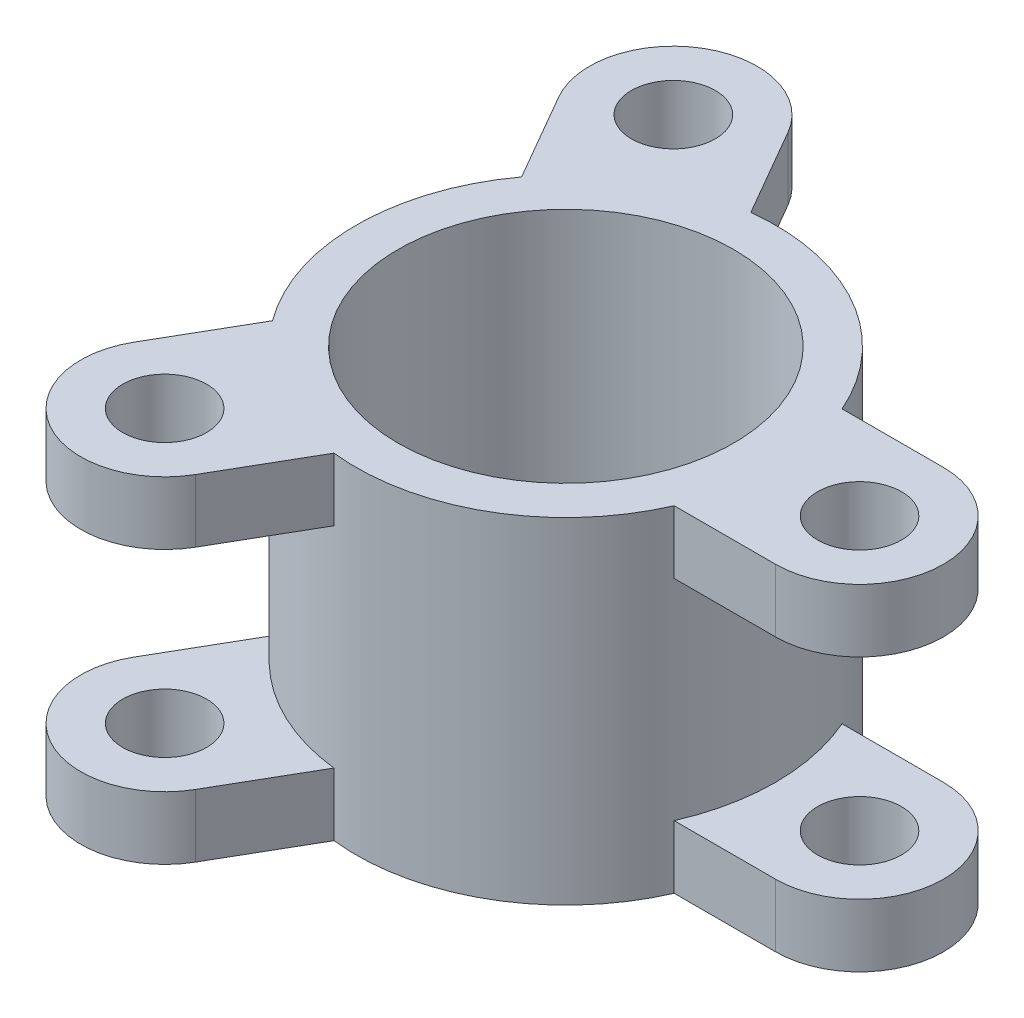
ISO-10303-21;
HEADER;
FILE_DESCRIPTION(('STEP AP214'),'2;1');
FILE_NAME('part.step','',(''),(''),'','','');
FILE_SCHEMA(('AUTOMOTIVE_DESIGN { 1 0 10303 214 1 1 1 1 }'));
ENDSEC;
DATA;
#1=APPLICATION_CONTEXT('core data for automotive mechanical design processes');
#2=APPLICATION_PROTOCOL_DEFINITION('international standard','automotive_design',2000,#1);
#3=PRODUCT_CONTEXT('',#1,'mechanical');
#4=PRODUCT('Part','Part','',(#3));
#5=PRODUCT_RELATED_PRODUCT_CATEGORY('part','',(#4));
#6=PRODUCT_DEFINITION_FORMATION('','',#4);
#7=PRODUCT_DEFINITION_CONTEXT('part definition',#1,'design');
#8=PRODUCT_DEFINITION('design','',#6,#7);
#9=PRODUCT_DEFINITION_SHAPE('','',#8);
#10=(LENGTH_UNIT() NAMED_UNIT(*) SI_UNIT(.MILLI.,.METRE.));
#11=(NAMED_UNIT(*) PLANE_ANGLE_UNIT() SI_UNIT($,.RADIAN.));
#12=(NAMED_UNIT(*) SI_UNIT($,.STERADIAN.) SOLID_ANGLE_UNIT());
#13=UNCERTAINTY_MEASURE_WITH_UNIT(LENGTH_MEASURE(1.E-05),#10,'distance_accuracy_value','');
#14=(GEOMETRIC_REPRESENTATION_CONTEXT(3) GLOBAL_UNCERTAINTY_ASSIGNED_CONTEXT((#13)) GLOBAL_UNIT_ASSIGNED_CONTEXT((#10,
#11,#12)) REPRESENTATION_CONTEXT('',''));
#15=CARTESIAN_POINT('',(0.,0.,0.));
#16=DIRECTION('',(0.,0.,1.));
#17=DIRECTION('',(1.,0.,0.));
#18=AXIS2_PLACEMENT_3D('',#15,#16,#17);
#19=CARTESIAN_POINT('',(0.,80.,0.));
#20=DIRECTION('',(0.,-1.,0.));
#21=DIRECTION('',(0.,0.,-1.));
#22=AXIS2_PLACEMENT_3D('',#19,#20,#21);
#23=CYLINDRICAL_SURFACE('',#22,50.);
#24=DIRECTION('',(0.,-1.,0.));
#25=VECTOR('',#24,1.);
#26=CARTESIAN_POINT('',(45.8257569495584,15.,-20.));
#27=LINE('',#26,#25);
#28=CARTESIAN_POINT('',(45.8257569495584,15.,-20.));
#29=VERTEX_POINT('',#28);
#30=CARTESIAN_POINT('',(45.8257569495584,0.,-20.));
#31=VERTEX_POINT('',#30);
#32=EDGE_CURVE('E327',#29,#31,#27,.T.);
#33=ORIENTED_EDGE('',*,*,#32,.T.);
#34=CARTESIAN_POINT('',(0.,0.,0.));
#35=DIRECTION('',(0.,1.,0.));
#36=DIRECTION('',(0.,0.,1.));
#37=AXIS2_PLACEMENT_3D('',#34,#35,#36);
#38=CIRCLE('',#37,50.);
#39=CARTESIAN_POINT('',(-5.59237039908998,0.,-49.6862696659689));
#40=VERTEX_POINT('',#39);
#41=EDGE_CURVE('E411',#31,#40,#38,.T.);
#42=ORIENTED_EDGE('',*,*,#41,.T.);
#43=DIRECTION('',(0.,-1.,0.));
#44=VECTOR('',#43,1.);
#45=CARTESIAN_POINT('',(-5.59237039908997,15.,-49.6862696659689));
#46=LINE('',#45,#44);
#47=CARTESIAN_POINT('',(-5.59237039908997,15.,-49.6862696659689));
#48=VERTEX_POINT('',#47);
#49=EDGE_CURVE('E360',#48,#40,#46,.T.);
#50=ORIENTED_EDGE('',*,*,#49,.F.);
#51=CARTESIAN_POINT('',(0.,15.,0.));
#52=DIRECTION('',(0.,1.,0.));
#53=DIRECTION('',(0.,0.,1.));
#54=AXIS2_PLACEMENT_3D('',#51,#52,#53);
#55=CIRCLE('',#54,50.);
#56=CARTESIAN_POINT('',(-40.2333865504677,15.,-29.6862696659692));
#57=VERTEX_POINT('',#56);
#58=EDGE_CURVE('E343',#48,#57,#55,.T.);
#59=ORIENTED_EDGE('',*,*,#58,.T.);
#60=DIRECTION('',(0.,-1.,0.));
#61=VECTOR('',#60,1.);
#62=CARTESIAN_POINT('',(-40.2333865504677,15.,-29.6862696659692));
#63=LINE('',#62,#61);
#64=CARTESIAN_POINT('',(-40.2333865504677,0.,-29.6862696659692));
#65=VERTEX_POINT('',#64);
#66=EDGE_CURVE('E363',#57,#65,#63,.T.);
#67=ORIENTED_EDGE('',*,*,#66,.T.);
#68=CARTESIAN_POINT('',(-40.2333865504681,0.,29.6862696659687));
#69=VERTEX_POINT('',#68);
#70=EDGE_CURVE('E408',#65,#69,#38,.T.);
#71=ORIENTED_EDGE('',*,*,#70,.T.);
#72=DIRECTION('',(0.,-1.,0.));
#73=VECTOR('',#72,1.);
#74=CARTESIAN_POINT('',(-40.2333865504681,15.,29.6862696659687));
#75=LINE('',#74,#73);
#76=CARTESIAN_POINT('',(-40.2333865504681,15.,29.6862696659687));
#77=VERTEX_POINT('',#76);
#78=EDGE_CURVE('E396',#77,#69,#75,.T.);
#79=ORIENTED_EDGE('',*,*,#78,.F.);
#80=CARTESIAN_POINT('',(0.,15.,0.));
#81=DIRECTION('',(0.,1.,0.));
#82=DIRECTION('',(0.,0.,1.));
#83=AXIS2_PLACEMENT_3D('',#80,#81,#82);
#84=CIRCLE('',#83,50.);
#85=CARTESIAN_POINT('',(-5.59237039909065,15.,49.6862696659688));
#86=VERTEX_POINT('',#85);
#87=EDGE_CURVE('E379',#77,#86,#84,.T.);
#88=ORIENTED_EDGE('',*,*,#87,.T.);
#89=DIRECTION('',(0.,-1.,0.));
#90=VECTOR('',#89,1.);
#91=CARTESIAN_POINT('',(-5.59237039909065,15.,49.6862696659688));
#92=LINE('',#91,#90);
#93=CARTESIAN_POINT('',(-5.59237039909065,0.,49.6862696659688));
#94=VERTEX_POINT('',#93);
#95=EDGE_CURVE('E399',#86,#94,#92,.T.);
#96=ORIENTED_EDGE('',*,*,#95,.T.);
#97=CARTESIAN_POINT('',(45.8257569495584,0.,20.));
#98=VERTEX_POINT('',#97);
#99=EDGE_CURVE('E38',#94,#98,#38,.T.);
#100=ORIENTED_EDGE('',*,*,#99,.T.);
#101=DIRECTION('',(0.,-1.,0.));
#102=VECTOR('',#101,1.);
#103=CARTESIAN_POINT('',(45.8257569495584,15.,20.));
#104=LINE('',#103,#102);
#105=CARTESIAN_POINT('',(45.8257569495584,15.,20.));
#106=VERTEX_POINT('',#105);
#107=EDGE_CURVE('E324',#106,#98,#104,.T.);
#108=ORIENTED_EDGE('',*,*,#107,.F.);
#109=CARTESIAN_POINT('',(0.,15.,0.));
#110=DIRECTION('',(0.,1.,0.));
#111=DIRECTION('',(0.,0.,1.));
#112=AXIS2_PLACEMENT_3D('',#109,#110,#111);
#113=CIRCLE('',#112,50.);
#114=EDGE_CURVE('E304',#106,#29,#113,.T.);
#115=ORIENTED_EDGE('',*,*,#114,.T.);
#116=EDGE_LOOP('',(#33,#42,#50,#59,#67,#71,#79,#88,#96,#100,#108,#115));
#117=FACE_BOUND('',#116,.T.);
#118=DIRECTION('',(0.,1.,0.));
#119=VECTOR('',#118,1.);
#120=CARTESIAN_POINT('',(45.8257569495584,65.,20.));
#121=LINE('',#120,#119);
#122=CARTESIAN_POINT('',(45.8257569495584,65.,20.));
#123=VERTEX_POINT('',#122);
#124=CARTESIAN_POINT('',(45.8257569495584,80.,20.));
#125=VERTEX_POINT('',#124);
#126=EDGE_CURVE('E206',#123,#125,#121,.T.);
#127=ORIENTED_EDGE('',*,*,#126,.T.);
#128=CARTESIAN_POINT('',(0.,80.,0.));
#129=DIRECTION('',(0.,1.,0.));
#130=DIRECTION('',(0.,0.,1.));
#131=AXIS2_PLACEMENT_3D('',#128,#129,#130);
#132=CIRCLE('',#131,50.);
#133=CARTESIAN_POINT('',(-5.59237039909065,80.,49.6862696659688));
#134=VERTEX_POINT('',#133);
#135=EDGE_CURVE('E11',#134,#125,#132,.T.);
#136=ORIENTED_EDGE('',*,*,#135,.F.);
#137=DIRECTION('',(0.,1.,0.));
#138=VECTOR('',#137,1.);
#139=CARTESIAN_POINT('',(-5.59237039909065,65.,49.6862696659688));
#140=LINE('',#139,#138);
#141=CARTESIAN_POINT('',(-5.59237039909065,65.,49.6862696659688));
#142=VERTEX_POINT('',#141);
#143=EDGE_CURVE('E287',#142,#134,#140,.T.);
#144=ORIENTED_EDGE('',*,*,#143,.F.);
#145=CARTESIAN_POINT('',(0.,65.,0.));
#146=DIRECTION('',(0.,1.,0.));
#147=DIRECTION('',(0.,0.,1.));
#148=AXIS2_PLACEMENT_3D('',#145,#146,#147);
#149=CIRCLE('',#148,50.);
#150=CARTESIAN_POINT('',(-40.2333865504681,65.,29.6862696659687));
#151=VERTEX_POINT('',#150);
#152=EDGE_CURVE('E271',#151,#142,#149,.T.);
#153=ORIENTED_EDGE('',*,*,#152,.F.);
#154=DIRECTION('',(0.,1.,0.));
#155=VECTOR('',#154,1.);
#156=CARTESIAN_POINT('',(-40.2333865504681,65.,29.6862696659687));
#157=LINE('',#156,#155);
#158=CARTESIAN_POINT('',(-40.2333865504681,80.,29.6862696659687));
#159=VERTEX_POINT('',#158);
#160=EDGE_CURVE('E290',#151,#159,#157,.T.);
#161=ORIENTED_EDGE('',*,*,#160,.T.);
#162=CARTESIAN_POINT('',(-40.2333865504677,80.,-29.6862696659692));
#163=VERTEX_POINT('',#162);
#164=EDGE_CURVE('E45',#163,#159,#132,.T.);
#165=ORIENTED_EDGE('',*,*,#164,.F.);
#166=DIRECTION('',(0.,1.,0.));
#167=VECTOR('',#166,1.);
#168=CARTESIAN_POINT('',(-40.2333865504677,65.,-29.6862696659692));
#169=LINE('',#168,#167);
#170=CARTESIAN_POINT('',(-40.2333865504677,65.,-29.6862696659692));
#171=VERTEX_POINT('',#170);
#172=EDGE_CURVE('E253',#171,#163,#169,.T.);
#173=ORIENTED_EDGE('',*,*,#172,.F.);
#174=CARTESIAN_POINT('',(0.,65.,0.));
#175=DIRECTION('',(0.,1.,0.));
#176=DIRECTION('',(0.,0.,1.));
#177=AXIS2_PLACEMENT_3D('',#174,#175,#176);
#178=CIRCLE('',#177,50.);
#179=CARTESIAN_POINT('',(-5.59237039908997,65.,-49.6862696659689));
#180=VERTEX_POINT('',#179);
#181=EDGE_CURVE('E240',#180,#171,#178,.T.);
#182=ORIENTED_EDGE('',*,*,#181,.F.);
#183=DIRECTION('',(0.,1.,0.));
#184=VECTOR('',#183,1.);
#185=CARTESIAN_POINT('',(-5.59237039908997,65.,-49.6862696659689));
#186=LINE('',#185,#184);
#187=CARTESIAN_POINT('',(-5.59237039908997,80.,-49.6862696659689));
#188=VERTEX_POINT('',#187);
#189=EDGE_CURVE('E255',#180,#188,#186,.T.);
#190=ORIENTED_EDGE('',*,*,#189,.T.);
#191=CARTESIAN_POINT('',(45.8257569495584,80.,-20.));
#192=VERTEX_POINT('',#191);
#193=EDGE_CURVE('E43',#192,#188,#132,.T.);
#194=ORIENTED_EDGE('',*,*,#193,.F.);
#195=DIRECTION('',(0.,1.,0.));
#196=VECTOR('',#195,1.);
#197=CARTESIAN_POINT('',(45.8257569495584,65.,-20.));
#198=LINE('',#197,#196);
#199=CARTESIAN_POINT('',(45.8257569495584,65.,-20.));
#200=VERTEX_POINT('',#199);
#201=EDGE_CURVE('E228',#200,#192,#198,.T.);
#202=ORIENTED_EDGE('',*,*,#201,.F.);
#203=CARTESIAN_POINT('',(0.,65.,0.));
#204=DIRECTION('',(0.,1.,0.));
#205=DIRECTION('',(0.,0.,1.));
#206=AXIS2_PLACEMENT_3D('',#203,#204,#205);
#207=CIRCLE('',#206,50.);
#208=EDGE_CURVE('E209',#123,#200,#207,.T.);
#209=ORIENTED_EDGE('',*,*,#208,.F.);
#210=EDGE_LOOP('',(#127,#136,#144,#153,#161,#165,#173,#182,#190,#194,#202,#209));
#211=FACE_BOUND('',#210,.T.);
#212=ADVANCED_FACE('F34',(#117,#211),#23,.T.);
#213=CARTESIAN_POINT('',(0.,80.,0.));
#214=DIRECTION('',(0.,-1.,0.));
#215=DIRECTION('',(0.,0.,-1.));
#216=AXIS2_PLACEMENT_3D('',#213,#214,#215);
#217=CYLINDRICAL_SURFACE('',#216,40.);
#218=CARTESIAN_POINT('',(0.,80.,0.));
#219=DIRECTION('',(0.,1.,0.));
#220=DIRECTION('',(0.,0.,1.));
#221=AXIS2_PLACEMENT_3D('',#218,#219,#220);
#222=CIRCLE('',#221,40.);
#223=CARTESIAN_POINT('',(0.,80.,40.));
#224=VERTEX_POINT('',#223);
#225=EDGE_CURVE('E405',#224,#224,#222,.T.);
#226=ORIENTED_EDGE('',*,*,#225,.T.);
#227=EDGE_LOOP('',(#226));
#228=FACE_BOUND('',#227,.T.);
#229=CARTESIAN_POINT('',(0.,0.,0.));
#230=DIRECTION('',(0.,1.,0.));
#231=DIRECTION('',(0.,0.,1.));
#232=AXIS2_PLACEMENT_3D('',#229,#230,#231);
#233=CIRCLE('',#232,40.);
#234=CARTESIAN_POINT('',(0.,0.,40.));
#235=VERTEX_POINT('',#234);
#236=EDGE_CURVE('E404',#235,#235,#233,.T.);
#237=ORIENTED_EDGE('',*,*,#236,.F.);
#238=EDGE_LOOP('',(#237));
#239=FACE_BOUND('',#238,.T.);
#240=ADVANCED_FACE('F36',(#228,#239),#217,.F.);
#241=CARTESIAN_POINT('',(0.,80.,0.));
#242=DIRECTION('',(0.,1.,0.));
#243=DIRECTION('',(0.,0.,1.));
#244=AXIS2_PLACEMENT_3D('',#241,#242,#243);
#245=PLANE('',#244);
#246=ORIENTED_EDGE('',*,*,#225,.F.);
#247=EDGE_LOOP('',(#246));
#248=FACE_BOUND('',#247,.T.);
#249=ORIENTED_EDGE('',*,*,#135,.T.);
#250=DIRECTION('',(-1.,0.,0.));
#251=VECTOR('',#250,1.);
#252=CARTESIAN_POINT('',(0.,80.,20.));
#253=LINE('',#252,#251);
#254=CARTESIAN_POINT('',(70.,80.,20.));
#255=VERTEX_POINT('',#254);
#256=EDGE_CURVE('E798',#255,#125,#253,.T.);
#257=ORIENTED_EDGE('',*,*,#256,.F.);
#258=CARTESIAN_POINT('',(70.,80.,0.));
#259=DIRECTION('',(0.,1.,0.));
#260=DIRECTION('',(0.,0.,1.));
#261=AXIS2_PLACEMENT_3D('',#258,#259,#260);
#262=CIRCLE('',#261,20.);
#263=CARTESIAN_POINT('',(70.,80.,-20.));
#264=VERTEX_POINT('',#263);
#265=EDGE_CURVE('E222',#264,#255,#262,.F.);
#266=ORIENTED_EDGE('',*,*,#265,.F.);
#267=DIRECTION('',(-1.,0.,0.));
#268=VECTOR('',#267,1.);
#269=CARTESIAN_POINT('',(0.,80.,-20.));
#270=LINE('',#269,#268);
#271=EDGE_CURVE('E52',#264,#192,#270,.T.);
#272=ORIENTED_EDGE('',*,*,#271,.T.);
#273=ORIENTED_EDGE('',*,*,#193,.T.);
#274=DIRECTION('',(0.499999999999992,0.,0.866025403784443));
#275=VECTOR('',#274,1.);
#276=CARTESIAN_POINT('',(17.3205080756889,80.,-9.99999999999983));
#277=LINE('',#276,#275);
#278=CARTESIAN_POINT('',(-17.6794919243106,80.,-70.6217782649109));
#279=VERTEX_POINT('',#278);
#280=EDGE_CURVE('E248',#279,#188,#277,.T.);
#281=ORIENTED_EDGE('',*,*,#280,.F.);
#282=CARTESIAN_POINT('',(-34.9999999999995,80.,-60.621778264911));
#283=DIRECTION('',(0.,1.,0.));
#284=DIRECTION('',(0.,0.,1.));
#285=AXIS2_PLACEMENT_3D('',#282,#283,#284);
#286=CIRCLE('',#285,20.);
#287=CARTESIAN_POINT('',(-52.3205080756883,80.,-50.6217782649112));
#288=VERTEX_POINT('',#287);
#289=EDGE_CURVE('E226',#288,#279,#286,.F.);
#290=ORIENTED_EDGE('',*,*,#289,.F.);
#291=DIRECTION('',(0.499999999999992,0.,0.866025403784443));
#292=VECTOR('',#291,1.);
#293=CARTESIAN_POINT('',(-17.3205080756889,80.,9.99999999999984));
#294=LINE('',#293,#292);
#295=EDGE_CURVE('E59',#288,#163,#294,.T.);
#296=ORIENTED_EDGE('',*,*,#295,.T.);
#297=ORIENTED_EDGE('',*,*,#164,.T.);
#298=DIRECTION('',(0.500000000000004,0.,-0.866025403784436));
#299=VECTOR('',#298,1.);
#300=CARTESIAN_POINT('',(-17.3205080756887,80.,-10.0000000000001));
#301=LINE('',#300,#299);
#302=CARTESIAN_POINT('',(-52.320508075689,80.,50.6217782649105));
#303=VERTEX_POINT('',#302);
#304=EDGE_CURVE('E282',#303,#159,#301,.T.);
#305=ORIENTED_EDGE('',*,*,#304,.F.);
#306=CARTESIAN_POINT('',(-35.0000000000003,80.,60.6217782649106));
#307=DIRECTION('',(0.,1.,0.));
#308=DIRECTION('',(0.,0.,1.));
#309=AXIS2_PLACEMENT_3D('',#306,#307,#308);
#310=CIRCLE('',#309,20.);
#311=CARTESIAN_POINT('',(-17.6794919243116,80.,70.6217782649107));
#312=VERTEX_POINT('',#311);
#313=EDGE_CURVE('E279',#312,#303,#310,.F.);
#314=ORIENTED_EDGE('',*,*,#313,.F.);
#315=DIRECTION('',(0.500000000000004,0.,-0.866025403784436));
#316=VECTOR('',#315,1.);
#317=CARTESIAN_POINT('',(17.3205080756887,80.,10.0000000000001));
#318=LINE('',#317,#316);
#319=EDGE_CURVE('E266',#312,#134,#318,.T.);
#320=ORIENTED_EDGE('',*,*,#319,.T.);
#321=EDGE_LOOP('',(#249,#257,#266,#272,#273,#281,#290,#296,#297,#305,#314,#320));
#322=FACE_BOUND('',#321,.T.);
#323=CARTESIAN_POINT('',(-35.0000000000003,80.,60.6217782649106));
#324=DIRECTION('',(0.,1.,0.));
#325=DIRECTION('',(0.,0.,1.));
#326=AXIS2_PLACEMENT_3D('',#323,#324,#325);
#327=CIRCLE('',#326,10.);
#328=CARTESIAN_POINT('',(-35.0000000000003,80.,70.6217782649106));
#329=VERTEX_POINT('',#328);
#330=EDGE_CURVE('E261',#329,#329,#327,.T.);
#331=ORIENTED_EDGE('',*,*,#330,.F.);
#332=EDGE_LOOP('',(#331));
#333=FACE_BOUND('',#332,.T.);
#334=CARTESIAN_POINT('',(-34.9999999999995,80.,-60.621778264911));
#335=DIRECTION('',(0.,1.,0.));
#336=DIRECTION('',(0.,0.,1.));
#337=AXIS2_PLACEMENT_3D('',#334,#335,#336);
#338=CIRCLE('',#337,9.99999999999999);
#339=CARTESIAN_POINT('',(-34.9999999999995,80.,-50.6217782649111));
#340=VERTEX_POINT('',#339);
#341=EDGE_CURVE('E223',#340,#340,#338,.T.);
#342=ORIENTED_EDGE('',*,*,#341,.F.);
#343=EDGE_LOOP('',(#342));
#344=FACE_BOUND('',#343,.T.);
#345=CARTESIAN_POINT('',(70.,80.,0.));
#346=DIRECTION('',(0.,1.,0.));
#347=DIRECTION('',(0.,0.,1.));
#348=AXIS2_PLACEMENT_3D('',#345,#346,#347);
#349=CIRCLE('',#348,9.99999999999999);
#350=CARTESIAN_POINT('',(70.,80.,9.99999999999999));
#351=VERTEX_POINT('',#350);
#352=EDGE_CURVE('E219',#351,#351,#349,.T.);
#353=ORIENTED_EDGE('',*,*,#352,.F.);
#354=EDGE_LOOP('',(#353));
#355=FACE_BOUND('',#354,.T.);
#356=ADVANCED_FACE('F450',(#248,#322,#333,#344,#355),#245,.T.);
#357=CARTESIAN_POINT('',(0.,0.,0.));
#358=DIRECTION('',(0.,1.,0.));
#359=DIRECTION('',(0.,0.,1.));
#360=AXIS2_PLACEMENT_3D('',#357,#358,#359);
#361=PLANE('',#360);
#362=ORIENTED_EDGE('',*,*,#236,.T.);
#363=EDGE_LOOP('',(#362));
#364=FACE_BOUND('',#363,.T.);
#365=ORIENTED_EDGE('',*,*,#99,.F.);
#366=DIRECTION('',(0.500000000000004,0.,-0.866025403784436));
#367=VECTOR('',#366,1.);
#368=CARTESIAN_POINT('',(17.3205080756887,0.,10.0000000000001));
#369=LINE('',#368,#367);
#370=CARTESIAN_POINT('',(-17.6794919243116,0.,70.6217782649107));
#371=VERTEX_POINT('',#370);
#372=EDGE_CURVE('E390',#371,#94,#369,.T.);
#373=ORIENTED_EDGE('',*,*,#372,.F.);
#374=CARTESIAN_POINT('',(-35.0000000000003,0.,60.6217782649106));
#375=DIRECTION('',(0.,1.,0.));
#376=DIRECTION('',(0.,0.,1.));
#377=AXIS2_PLACEMENT_3D('',#374,#375,#376);
#378=CIRCLE('',#377,20.);
#379=CARTESIAN_POINT('',(-52.320508075689,0.,50.6217782649105));
#380=VERTEX_POINT('',#379);
#381=EDGE_CURVE('E387',#371,#380,#378,.F.);
#382=ORIENTED_EDGE('',*,*,#381,.T.);
#383=DIRECTION('',(0.500000000000004,0.,-0.866025403784436));
#384=VECTOR('',#383,1.);
#385=CARTESIAN_POINT('',(-17.3205080756887,0.,-10.0000000000001));
#386=LINE('',#385,#384);
#387=EDGE_CURVE('E373',#380,#69,#386,.T.);
#388=ORIENTED_EDGE('',*,*,#387,.T.);
#389=ORIENTED_EDGE('',*,*,#70,.F.);
#390=DIRECTION('',(0.499999999999992,0.,0.866025403784443));
#391=VECTOR('',#390,1.);
#392=CARTESIAN_POINT('',(-17.3205080756889,0.,9.99999999999984));
#393=LINE('',#392,#391);
#394=CARTESIAN_POINT('',(-52.3205080756883,0.,-50.6217782649112));
#395=VERTEX_POINT('',#394);
#396=EDGE_CURVE('E354',#395,#65,#393,.T.);
#397=ORIENTED_EDGE('',*,*,#396,.F.);
#398=CARTESIAN_POINT('',(-34.9999999999995,0.,-60.621778264911));
#399=DIRECTION('',(0.,1.,0.));
#400=DIRECTION('',(0.,0.,1.));
#401=AXIS2_PLACEMENT_3D('',#398,#399,#400);
#402=CIRCLE('',#401,20.);
#403=CARTESIAN_POINT('',(-17.6794919243106,0.,-70.6217782649109));
#404=VERTEX_POINT('',#403);
#405=EDGE_CURVE('E351',#395,#404,#402,.F.);
#406=ORIENTED_EDGE('',*,*,#405,.T.);
#407=DIRECTION('',(0.499999999999992,0.,0.866025403784443));
#408=VECTOR('',#407,1.);
#409=CARTESIAN_POINT('',(17.3205080756889,0.,-9.99999999999983));
#410=LINE('',#409,#408);
#411=EDGE_CURVE('E337',#404,#40,#410,.T.);
#412=ORIENTED_EDGE('',*,*,#411,.T.);
#413=ORIENTED_EDGE('',*,*,#41,.F.);
#414=DIRECTION('',(-1.,0.,0.));
#415=VECTOR('',#414,1.);
#416=CARTESIAN_POINT('',(0.,0.,-20.));
#417=LINE('',#416,#415);
#418=CARTESIAN_POINT('',(70.,0.,-20.));
#419=VERTEX_POINT('',#418);
#420=EDGE_CURVE('E315',#419,#31,#417,.T.);
#421=ORIENTED_EDGE('',*,*,#420,.F.);
#422=CARTESIAN_POINT('',(70.,0.,0.));
#423=DIRECTION('',(0.,1.,0.));
#424=DIRECTION('',(0.,0.,1.));
#425=AXIS2_PLACEMENT_3D('',#422,#423,#424);
#426=CIRCLE('',#425,20.);
#427=CARTESIAN_POINT('',(70.,0.,20.));
#428=VERTEX_POINT('',#427);
#429=EDGE_CURVE('E296',#419,#428,#426,.F.);
#430=ORIENTED_EDGE('',*,*,#429,.T.);
#431=DIRECTION('',(-1.,0.,0.));
#432=VECTOR('',#431,1.);
#433=CARTESIAN_POINT('',(0.,0.,20.));
#434=LINE('',#433,#432);
#435=EDGE_CURVE('E318',#428,#98,#434,.T.);
#436=ORIENTED_EDGE('',*,*,#435,.T.);
#437=EDGE_LOOP('',(#365,#373,#382,#388,#389,#397,#406,#412,#413,#421,#430,#436));
#438=FACE_BOUND('',#437,.T.);
#439=CARTESIAN_POINT('',(-35.0000000000003,0.,60.6217782649106));
#440=DIRECTION('',(0.,1.,0.));
#441=DIRECTION('',(0.,0.,1.));
#442=AXIS2_PLACEMENT_3D('',#439,#440,#441);
#443=CIRCLE('',#442,10.);
#444=CARTESIAN_POINT('',(-35.0000000000003,0.,70.6217782649106));
#445=VERTEX_POINT('',#444);
#446=EDGE_CURVE('E368',#445,#445,#443,.T.);
#447=ORIENTED_EDGE('',*,*,#446,.T.);
#448=EDGE_LOOP('',(#447));
#449=FACE_BOUND('',#448,.T.);
#450=CARTESIAN_POINT('',(-34.9999999999995,0.,-60.621778264911));
#451=DIRECTION('',(0.,1.,0.));
#452=DIRECTION('',(0.,0.,1.));
#453=AXIS2_PLACEMENT_3D('',#450,#451,#452);
#454=CIRCLE('',#453,9.99999999999999);
#455=CARTESIAN_POINT('',(-34.9999999999995,0.,-50.6217782649111));
#456=VERTEX_POINT('',#455);
#457=EDGE_CURVE('E332',#456,#456,#454,.T.);
#458=ORIENTED_EDGE('',*,*,#457,.T.);
#459=EDGE_LOOP('',(#458));
#460=FACE_BOUND('',#459,.T.);
#461=CARTESIAN_POINT('',(70.,0.,0.));
#462=DIRECTION('',(0.,1.,0.));
#463=DIRECTION('',(0.,0.,1.));
#464=AXIS2_PLACEMENT_3D('',#461,#462,#463);
#465=CIRCLE('',#464,9.99999999999999);
#466=CARTESIAN_POINT('',(70.,0.,9.99999999999999));
#467=VERTEX_POINT('',#466);
#468=EDGE_CURVE('E301',#467,#467,#465,.T.);
#469=ORIENTED_EDGE('',*,*,#468,.T.);
#470=EDGE_LOOP('',(#469));
#471=FACE_BOUND('',#470,.T.);
#472=ADVANCED_FACE('F422',(#364,#438,#449,#460,#471),#361,.F.);
#473=CARTESIAN_POINT('',(-35.0000000000003,15.,60.6217782649106));
#474=DIRECTION('',(0.,-1.,0.));
#475=DIRECTION('',(0.,0.,-1.));
#476=AXIS2_PLACEMENT_3D('',#473,#474,#475);
#477=CYLINDRICAL_SURFACE('',#476,20.);
#478=ORIENTED_EDGE('',*,*,#381,.F.);
#479=DIRECTION('',(0.,-1.,0.));
#480=VECTOR('',#479,1.);
#481=CARTESIAN_POINT('',(-17.6794919243116,15.,70.6217782649107));
#482=LINE('',#481,#480);
#483=CARTESIAN_POINT('',(-17.6794919243116,15.,70.6217782649107));
#484=VERTEX_POINT('',#483);
#485=EDGE_CURVE('E402',#484,#371,#482,.T.);
#486=ORIENTED_EDGE('',*,*,#485,.F.);
#487=CARTESIAN_POINT('',(-35.0000000000003,15.,60.6217782649106));
#488=DIRECTION('',(0.,1.,0.));
#489=DIRECTION('',(0.,0.,1.));
#490=AXIS2_PLACEMENT_3D('',#487,#488,#489);
#491=CIRCLE('',#490,20.);
#492=CARTESIAN_POINT('',(-52.320508075689,15.,50.6217782649105));
#493=VERTEX_POINT('',#492);
#494=EDGE_CURVE('E372',#484,#493,#491,.F.);
#495=ORIENTED_EDGE('',*,*,#494,.T.);
#496=DIRECTION('',(0.,-1.,0.));
#497=VECTOR('',#496,1.);
#498=CARTESIAN_POINT('',(-52.320508075689,15.,50.6217782649105));
#499=LINE('',#498,#497);
#500=EDGE_CURVE('E384',#493,#380,#499,.T.);
#501=ORIENTED_EDGE('',*,*,#500,.T.);
#502=EDGE_LOOP('',(#478,#486,#495,#501));
#503=FACE_BOUND('',#502,.T.);
#504=ADVANCED_FACE('F455',(#503),#477,.T.);
#505=CARTESIAN_POINT('',(17.3205080756887,15.,10.0000000000001));
#506=DIRECTION('',(-0.866025403784436,0.,-0.500000000000004));
#507=DIRECTION('',(-0.500000000000004,0.,0.866025403784436));
#508=AXIS2_PLACEMENT_3D('',#505,#506,#507);
#509=PLANE('',#508);
#510=ORIENTED_EDGE('',*,*,#372,.T.);
#511=ORIENTED_EDGE('',*,*,#95,.F.);
#512=DIRECTION('',(0.500000000000004,0.,-0.866025403784436));
#513=VECTOR('',#512,1.);
#514=CARTESIAN_POINT('',(17.3205080756887,15.,10.0000000000001));
#515=LINE('',#514,#513);
#516=EDGE_CURVE('E376',#484,#86,#515,.T.);
#517=ORIENTED_EDGE('',*,*,#516,.F.);
#518=ORIENTED_EDGE('',*,*,#485,.T.);
#519=EDGE_LOOP('',(#510,#511,#517,#518));
#520=FACE_BOUND('',#519,.T.);
#521=ADVANCED_FACE('F463',(#520),#509,.F.);
#522=CARTESIAN_POINT('',(-35.0000000000003,15.,60.6217782649106));
#523=DIRECTION('',(0.,-1.,0.));
#524=DIRECTION('',(0.,0.,-1.));
#525=AXIS2_PLACEMENT_3D('',#522,#523,#524);
#526=CYLINDRICAL_SURFACE('',#525,10.);
#527=CARTESIAN_POINT('',(-35.0000000000003,15.,60.6217782649106));
#528=DIRECTION('',(0.,1.,0.));
#529=DIRECTION('',(0.,0.,1.));
#530=AXIS2_PLACEMENT_3D('',#527,#528,#529);
#531=CIRCLE('',#530,10.);
#532=CARTESIAN_POINT('',(-35.0000000000003,15.,70.6217782649106));
#533=VERTEX_POINT('',#532);
#534=EDGE_CURVE('E369',#533,#533,#531,.T.);
#535=ORIENTED_EDGE('',*,*,#534,.T.);
#536=EDGE_LOOP('',(#535));
#537=FACE_BOUND('',#536,.T.);
#538=ORIENTED_EDGE('',*,*,#446,.F.);
#539=EDGE_LOOP('',(#538));
#540=FACE_BOUND('',#539,.T.);
#541=ADVANCED_FACE('F459',(#537,#540),#526,.F.);
#542=CARTESIAN_POINT('',(-17.3205080756887,15.,-10.0000000000001));
#543=DIRECTION('',(-0.866025403784436,0.,-0.500000000000004));
#544=DIRECTION('',(-0.500000000000004,0.,0.866025403784436));
#545=AXIS2_PLACEMENT_3D('',#542,#543,#544);
#546=PLANE('',#545);
#547=ORIENTED_EDGE('',*,*,#387,.F.);
#548=ORIENTED_EDGE('',*,*,#500,.F.);
#549=DIRECTION('',(0.500000000000004,0.,-0.866025403784436));
#550=VECTOR('',#549,1.);
#551=CARTESIAN_POINT('',(-17.3205080756887,15.,-10.0000000000001));
#552=LINE('',#551,#550);
#553=EDGE_CURVE('E381',#493,#77,#552,.T.);
#554=ORIENTED_EDGE('',*,*,#553,.T.);
#555=ORIENTED_EDGE('',*,*,#78,.T.);
#556=EDGE_LOOP('',(#547,#548,#554,#555));
#557=FACE_BOUND('',#556,.T.);
#558=ADVANCED_FACE('F462',(#557),#546,.T.);
#559=CARTESIAN_POINT('',(0.,15.,0.));
#560=DIRECTION('',(0.,1.,0.));
#561=DIRECTION('',(0.,0.,1.));
#562=AXIS2_PLACEMENT_3D('',#559,#560,#561);
#563=PLANE('',#562);
#564=ORIENTED_EDGE('',*,*,#534,.F.);
#565=EDGE_LOOP('',(#564));
#566=FACE_BOUND('',#565,.T.);
#567=ORIENTED_EDGE('',*,*,#494,.F.);
#568=ORIENTED_EDGE('',*,*,#516,.T.);
#569=ORIENTED_EDGE('',*,*,#87,.F.);
#570=ORIENTED_EDGE('',*,*,#553,.F.);
#571=EDGE_LOOP('',(#567,#568,#569,#570));
#572=FACE_BOUND('',#571,.T.);
#573=ADVANCED_FACE('F473',(#566,#572),#563,.T.);
#574=CARTESIAN_POINT('',(-34.9999999999995,15.,-60.621778264911));
#575=DIRECTION('',(0.,-1.,0.));
#576=DIRECTION('',(0.,0.,-1.));
#577=AXIS2_PLACEMENT_3D('',#574,#575,#576);
#578=CYLINDRICAL_SURFACE('',#577,20.);
#579=ORIENTED_EDGE('',*,*,#405,.F.);
#580=DIRECTION('',(0.,-1.,0.));
#581=VECTOR('',#580,1.);
#582=CARTESIAN_POINT('',(-52.3205080756883,15.,-50.6217782649112));
#583=LINE('',#582,#581);
#584=CARTESIAN_POINT('',(-52.3205080756883,15.,-50.6217782649112));
#585=VERTEX_POINT('',#584);
#586=EDGE_CURVE('E366',#585,#395,#583,.T.);
#587=ORIENTED_EDGE('',*,*,#586,.F.);
#588=CARTESIAN_POINT('',(-34.9999999999995,15.,-60.621778264911));
#589=DIRECTION('',(0.,1.,0.));
#590=DIRECTION('',(0.,0.,1.));
#591=AXIS2_PLACEMENT_3D('',#588,#589,#590);
#592=CIRCLE('',#591,20.);
#593=CARTESIAN_POINT('',(-17.6794919243106,15.,-70.6217782649109));
#594=VERTEX_POINT('',#593);
#595=EDGE_CURVE('E336',#585,#594,#592,.F.);
#596=ORIENTED_EDGE('',*,*,#595,.T.);
#597=DIRECTION('',(0.,-1.,0.));
#598=VECTOR('',#597,1.);
#599=CARTESIAN_POINT('',(-17.6794919243106,15.,-70.6217782649109));
#600=LINE('',#599,#598);
#601=EDGE_CURVE('E348',#594,#404,#600,.T.);
#602=ORIENTED_EDGE('',*,*,#601,.T.);
#603=EDGE_LOOP('',(#579,#587,#596,#602));
#604=FACE_BOUND('',#603,.T.);
#605=ADVANCED_FACE('F477',(#604),#578,.T.);
#606=CARTESIAN_POINT('',(-17.3205080756889,15.,9.99999999999984));
#607=DIRECTION('',(0.866025403784443,0.,-0.499999999999992));
#608=DIRECTION('',(-0.499999999999992,0.,-0.866025403784443));
#609=AXIS2_PLACEMENT_3D('',#606,#607,#608);
#610=PLANE('',#609);
#611=ORIENTED_EDGE('',*,*,#396,.T.);
#612=ORIENTED_EDGE('',*,*,#66,.F.);
#613=DIRECTION('',(0.499999999999992,0.,0.866025403784443));
#614=VECTOR('',#613,1.);
#615=CARTESIAN_POINT('',(-17.3205080756889,15.,9.99999999999984));
#616=LINE('',#615,#614);
#617=EDGE_CURVE('E340',#585,#57,#616,.T.);
#618=ORIENTED_EDGE('',*,*,#617,.F.);
#619=ORIENTED_EDGE('',*,*,#586,.T.);
#620=EDGE_LOOP('',(#611,#612,#618,#619));
#621=FACE_BOUND('',#620,.T.);
#622=ADVANCED_FACE('F483',(#621),#610,.F.);
#623=CARTESIAN_POINT('',(-34.9999999999995,15.,-60.621778264911));
#624=DIRECTION('',(0.,-1.,0.));
#625=DIRECTION('',(0.,0.,-1.));
#626=AXIS2_PLACEMENT_3D('',#623,#624,#625);
#627=CYLINDRICAL_SURFACE('',#626,9.99999999999999);
#628=CARTESIAN_POINT('',(-34.9999999999995,15.,-60.621778264911));
#629=DIRECTION('',(0.,1.,0.));
#630=DIRECTION('',(0.,0.,1.));
#631=AXIS2_PLACEMENT_3D('',#628,#629,#630);
#632=CIRCLE('',#631,9.99999999999999);
#633=CARTESIAN_POINT('',(-34.9999999999995,15.,-50.6217782649111));
#634=VERTEX_POINT('',#633);
#635=EDGE_CURVE('E333',#634,#634,#632,.T.);
#636=ORIENTED_EDGE('',*,*,#635,.T.);
#637=EDGE_LOOP('',(#636));
#638=FACE_BOUND('',#637,.T.);
#639=ORIENTED_EDGE('',*,*,#457,.F.);
#640=EDGE_LOOP('',(#639));
#641=FACE_BOUND('',#640,.T.);
#642=ADVANCED_FACE('F479',(#638,#641),#627,.F.);
#643=CARTESIAN_POINT('',(17.3205080756889,15.,-9.99999999999983));
#644=DIRECTION('',(0.866025403784443,0.,-0.499999999999992));
#645=DIRECTION('',(-0.499999999999992,0.,-0.866025403784443));
#646=AXIS2_PLACEMENT_3D('',#643,#644,#645);
#647=PLANE('',#646);
#648=ORIENTED_EDGE('',*,*,#411,.F.);
#649=ORIENTED_EDGE('',*,*,#601,.F.);
#650=DIRECTION('',(0.499999999999992,0.,0.866025403784443));
#651=VECTOR('',#650,1.);
#652=CARTESIAN_POINT('',(17.3205080756889,15.,-9.99999999999983));
#653=LINE('',#652,#651);
#654=EDGE_CURVE('E345',#594,#48,#653,.T.);
#655=ORIENTED_EDGE('',*,*,#654,.T.);
#656=ORIENTED_EDGE('',*,*,#49,.T.);
#657=EDGE_LOOP('',(#648,#649,#655,#656));
#658=FACE_BOUND('',#657,.T.);
#659=ADVANCED_FACE('F482',(#658),#647,.T.);
#660=CARTESIAN_POINT('',(0.,15.,0.));
#661=DIRECTION('',(0.,1.,0.));
#662=DIRECTION('',(0.,0.,1.));
#663=AXIS2_PLACEMENT_3D('',#660,#661,#662);
#664=PLANE('',#663);
#665=ORIENTED_EDGE('',*,*,#635,.F.);
#666=EDGE_LOOP('',(#665));
#667=FACE_BOUND('',#666,.T.);
#668=ORIENTED_EDGE('',*,*,#595,.F.);
#669=ORIENTED_EDGE('',*,*,#617,.T.);
#670=ORIENTED_EDGE('',*,*,#58,.F.);
#671=ORIENTED_EDGE('',*,*,#654,.F.);
#672=EDGE_LOOP('',(#668,#669,#670,#671));
#673=FACE_BOUND('',#672,.T.);
#674=ADVANCED_FACE('F444',(#667,#673),#664,.T.);
#675=CARTESIAN_POINT('',(70.,15.,0.));
#676=DIRECTION('',(0.,-1.,0.));
#677=DIRECTION('',(0.,0.,-1.));
#678=AXIS2_PLACEMENT_3D('',#675,#676,#677);
#679=CYLINDRICAL_SURFACE('',#678,20.);
#680=ORIENTED_EDGE('',*,*,#429,.F.);
#681=DIRECTION('',(0.,-1.,0.));
#682=VECTOR('',#681,1.);
#683=CARTESIAN_POINT('',(70.,15.,-20.));
#684=LINE('',#683,#682);
#685=CARTESIAN_POINT('',(70.,15.,-20.));
#686=VERTEX_POINT('',#685);
#687=EDGE_CURVE('E330',#686,#419,#684,.T.);
#688=ORIENTED_EDGE('',*,*,#687,.F.);
#689=CARTESIAN_POINT('',(70.,15.,0.));
#690=DIRECTION('',(0.,1.,0.));
#691=DIRECTION('',(0.,0.,1.));
#692=AXIS2_PLACEMENT_3D('',#689,#690,#691);
#693=CIRCLE('',#692,20.);
#694=CARTESIAN_POINT('',(70.,15.,20.));
#695=VERTEX_POINT('',#694);
#696=EDGE_CURVE('E297',#686,#695,#693,.F.);
#697=ORIENTED_EDGE('',*,*,#696,.T.);
#698=DIRECTION('',(0.,-1.,0.));
#699=VECTOR('',#698,1.);
#700=CARTESIAN_POINT('',(70.,15.,20.));
#701=LINE('',#700,#699);
#702=EDGE_CURVE('E312',#695,#428,#701,.T.);
#703=ORIENTED_EDGE('',*,*,#702,.T.);
#704=EDGE_LOOP('',(#680,#688,#697,#703));
#705=FACE_BOUND('',#704,.T.);
#706=ADVANCED_FACE('F427',(#705),#679,.T.);
#707=CARTESIAN_POINT('',(0.,15.,-20.));
#708=DIRECTION('',(0.,0.,1.));
#709=DIRECTION('',(1.,0.,0.));
#710=AXIS2_PLACEMENT_3D('',#707,#708,#709);
#711=PLANE('',#710);
#712=ORIENTED_EDGE('',*,*,#420,.T.);
#713=ORIENTED_EDGE('',*,*,#32,.F.);
#714=DIRECTION('',(-1.,0.,0.));
#715=VECTOR('',#714,1.);
#716=CARTESIAN_POINT('',(0.,15.,-20.));
#717=LINE('',#716,#715);
#718=EDGE_CURVE('E300',#686,#29,#717,.T.);
#719=ORIENTED_EDGE('',*,*,#718,.F.);
#720=ORIENTED_EDGE('',*,*,#687,.T.);
#721=EDGE_LOOP('',(#712,#713,#719,#720));
#722=FACE_BOUND('',#721,.T.);
#723=ADVANCED_FACE('F435',(#722),#711,.F.);
#724=CARTESIAN_POINT('',(0.,15.,20.));
#725=DIRECTION('',(0.,0.,1.));
#726=DIRECTION('',(1.,0.,0.));
#727=AXIS2_PLACEMENT_3D('',#724,#725,#726);
#728=PLANE('',#727);
#729=ORIENTED_EDGE('',*,*,#435,.F.);
#730=ORIENTED_EDGE('',*,*,#702,.F.);
#731=DIRECTION('',(-1.,0.,0.));
#732=VECTOR('',#731,1.);
#733=CARTESIAN_POINT('',(0.,15.,20.));
#734=LINE('',#733,#732);
#735=EDGE_CURVE('E306',#695,#106,#734,.T.);
#736=ORIENTED_EDGE('',*,*,#735,.T.);
#737=ORIENTED_EDGE('',*,*,#107,.T.);
#738=EDGE_LOOP('',(#729,#730,#736,#737));
#739=FACE_BOUND('',#738,.T.);
#740=ADVANCED_FACE('F420',(#739),#728,.T.);
#741=CARTESIAN_POINT('',(70.,15.,0.));
#742=DIRECTION('',(0.,-1.,0.));
#743=DIRECTION('',(0.,0.,-1.));
#744=AXIS2_PLACEMENT_3D('',#741,#742,#743);
#745=CYLINDRICAL_SURFACE('',#744,9.99999999999999);
#746=CARTESIAN_POINT('',(70.,15.,0.));
#747=DIRECTION('',(0.,1.,0.));
#748=DIRECTION('',(0.,0.,1.));
#749=AXIS2_PLACEMENT_3D('',#746,#747,#748);
#750=CIRCLE('',#749,9.99999999999999);
#751=CARTESIAN_POINT('',(70.,15.,9.99999999999999));
#752=VERTEX_POINT('',#751);
#753=EDGE_CURVE('E309',#752,#752,#750,.T.);
#754=ORIENTED_EDGE('',*,*,#753,.T.);
#755=EDGE_LOOP('',(#754));
#756=FACE_BOUND('',#755,.T.);
#757=ORIENTED_EDGE('',*,*,#468,.F.);
#758=EDGE_LOOP('',(#757));
#759=FACE_BOUND('',#758,.T.);
#760=ADVANCED_FACE('F442',(#756,#759),#745,.F.);
#761=CARTESIAN_POINT('',(0.,15.,0.));
#762=DIRECTION('',(0.,1.,0.));
#763=DIRECTION('',(0.,0.,1.));
#764=AXIS2_PLACEMENT_3D('',#761,#762,#763);
#765=PLANE('',#764);
#766=ORIENTED_EDGE('',*,*,#696,.F.);
#767=ORIENTED_EDGE('',*,*,#718,.T.);
#768=ORIENTED_EDGE('',*,*,#114,.F.);
#769=ORIENTED_EDGE('',*,*,#735,.F.);
#770=EDGE_LOOP('',(#766,#767,#768,#769));
#771=FACE_BOUND('',#770,.T.);
#772=ORIENTED_EDGE('',*,*,#753,.F.);
#773=EDGE_LOOP('',(#772));
#774=FACE_BOUND('',#773,.T.);
#775=ADVANCED_FACE('F431',(#771,#774),#765,.T.);
#776=CARTESIAN_POINT('',(-35.0000000000003,65.,60.6217782649106));
#777=DIRECTION('',(0.,1.,0.));
#778=DIRECTION('',(0.,0.,1.));
#779=AXIS2_PLACEMENT_3D('',#776,#777,#778);
#780=CYLINDRICAL_SURFACE('',#779,20.);
#781=ORIENTED_EDGE('',*,*,#313,.T.);
#782=DIRECTION('',(0.,1.,0.));
#783=VECTOR('',#782,1.);
#784=CARTESIAN_POINT('',(-52.320508075689,65.,50.6217782649105));
#785=LINE('',#784,#783);
#786=CARTESIAN_POINT('',(-52.320508075689,65.,50.6217782649105));
#787=VERTEX_POINT('',#786);
#788=EDGE_CURVE('E293',#787,#303,#785,.T.);
#789=ORIENTED_EDGE('',*,*,#788,.F.);
#790=CARTESIAN_POINT('',(-35.0000000000003,65.,60.6217782649106));
#791=DIRECTION('',(0.,1.,0.));
#792=DIRECTION('',(0.,0.,1.));
#793=AXIS2_PLACEMENT_3D('',#790,#791,#792);
#794=CIRCLE('',#793,20.);
#795=CARTESIAN_POINT('',(-17.6794919243116,65.,70.6217782649107));
#796=VERTEX_POINT('',#795);
#797=EDGE_CURVE('E265',#796,#787,#794,.F.);
#798=ORIENTED_EDGE('',*,*,#797,.F.);
#799=DIRECTION('',(0.,1.,0.));
#800=VECTOR('',#799,1.);
#801=CARTESIAN_POINT('',(-17.6794919243116,65.,70.6217782649107));
#802=LINE('',#801,#800);
#803=EDGE_CURVE('E276',#796,#312,#802,.T.);
#804=ORIENTED_EDGE('',*,*,#803,.T.);
#805=EDGE_LOOP('',(#781,#789,#798,#804));
#806=FACE_BOUND('',#805,.T.);
#807=ADVANCED_FACE('F527',(#806),#780,.T.);
#808=CARTESIAN_POINT('',(-17.3205080756887,65.,-10.0000000000001));
#809=DIRECTION('',(0.866025403784436,0.,0.500000000000004));
#810=DIRECTION('',(0.500000000000004,0.,-0.866025403784436));
#811=AXIS2_PLACEMENT_3D('',#808,#809,#810);
#812=PLANE('',#811);
#813=ORIENTED_EDGE('',*,*,#304,.T.);
#814=ORIENTED_EDGE('',*,*,#160,.F.);
#815=DIRECTION('',(0.500000000000004,0.,-0.866025403784436));
#816=VECTOR('',#815,1.);
#817=CARTESIAN_POINT('',(-17.3205080756887,65.,-10.0000000000001));
#818=LINE('',#817,#816);
#819=EDGE_CURVE('E269',#787,#151,#818,.T.);
#820=ORIENTED_EDGE('',*,*,#819,.F.);
#821=ORIENTED_EDGE('',*,*,#788,.T.);
#822=EDGE_LOOP('',(#813,#814,#820,#821));
#823=FACE_BOUND('',#822,.T.);
#824=ADVANCED_FACE('F534',(#823),#812,.F.);
#825=CARTESIAN_POINT('',(-35.0000000000003,65.,60.6217782649106));
#826=DIRECTION('',(0.,1.,0.));
#827=DIRECTION('',(0.,0.,1.));
#828=AXIS2_PLACEMENT_3D('',#825,#826,#827);
#829=CYLINDRICAL_SURFACE('',#828,10.);
#830=CARTESIAN_POINT('',(-35.0000000000003,65.,60.6217782649106));
#831=DIRECTION('',(0.,1.,0.));
#832=DIRECTION('',(0.,0.,1.));
#833=AXIS2_PLACEMENT_3D('',#830,#831,#832);
#834=CIRCLE('',#833,10.);
#835=CARTESIAN_POINT('',(-35.0000000000003,65.,70.6217782649106));
#836=VERTEX_POINT('',#835);
#837=EDGE_CURVE('E262',#836,#836,#834,.T.);
#838=ORIENTED_EDGE('',*,*,#837,.F.);
#839=EDGE_LOOP('',(#838));
#840=FACE_BOUND('',#839,.T.);
#841=ORIENTED_EDGE('',*,*,#330,.T.);
#842=EDGE_LOOP('',(#841));
#843=FACE_BOUND('',#842,.T.);
#844=ADVANCED_FACE('F530',(#840,#843),#829,.F.);
#845=CARTESIAN_POINT('',(17.3205080756887,65.,10.0000000000001));
#846=DIRECTION('',(0.866025403784436,0.,0.500000000000004));
#847=DIRECTION('',(0.500000000000004,0.,-0.866025403784436));
#848=AXIS2_PLACEMENT_3D('',#845,#846,#847);
#849=PLANE('',#848);
#850=ORIENTED_EDGE('',*,*,#319,.F.);
#851=ORIENTED_EDGE('',*,*,#803,.F.);
#852=DIRECTION('',(0.500000000000004,0.,-0.866025403784436));
#853=VECTOR('',#852,1.);
#854=CARTESIAN_POINT('',(17.3205080756887,65.,10.0000000000001));
#855=LINE('',#854,#853);
#856=EDGE_CURVE('E273',#796,#142,#855,.T.);
#857=ORIENTED_EDGE('',*,*,#856,.T.);
#858=ORIENTED_EDGE('',*,*,#143,.T.);
#859=EDGE_LOOP('',(#850,#851,#857,#858));
#860=FACE_BOUND('',#859,.T.);
#861=ADVANCED_FACE('F533',(#860),#849,.T.);
#862=CARTESIAN_POINT('',(0.,65.,0.));
#863=DIRECTION('',(0.,-1.,0.));
#864=DIRECTION('',(0.,0.,1.));
#865=AXIS2_PLACEMENT_3D('',#862,#863,#864);
#866=PLANE('',#865);
#867=ORIENTED_EDGE('',*,*,#837,.T.);
#868=EDGE_LOOP('',(#867));
#869=FACE_BOUND('',#868,.T.);
#870=ORIENTED_EDGE('',*,*,#797,.T.);
#871=ORIENTED_EDGE('',*,*,#819,.T.);
#872=ORIENTED_EDGE('',*,*,#152,.T.);
#873=ORIENTED_EDGE('',*,*,#856,.F.);
#874=EDGE_LOOP('',(#870,#871,#872,#873));
#875=FACE_BOUND('',#874,.T.);
#876=ADVANCED_FACE('F544',(#869,#875),#866,.T.);
#877=CARTESIAN_POINT('',(-34.9999999999995,65.,-60.621778264911));
#878=DIRECTION('',(0.,1.,0.));
#879=DIRECTION('',(0.,0.,1.));
#880=AXIS2_PLACEMENT_3D('',#877,#878,#879);
#881=CYLINDRICAL_SURFACE('',#880,20.);
#882=ORIENTED_EDGE('',*,*,#289,.T.);
#883=DIRECTION('',(0.,1.,0.));
#884=VECTOR('',#883,1.);
#885=CARTESIAN_POINT('',(-17.6794919243106,65.,-70.6217782649109));
#886=LINE('',#885,#884);
#887=CARTESIAN_POINT('',(-17.6794919243106,65.,-70.6217782649109));
#888=VERTEX_POINT('',#887);
#889=EDGE_CURVE('E258',#888,#279,#886,.T.);
#890=ORIENTED_EDGE('',*,*,#889,.F.);
#891=CARTESIAN_POINT('',(-34.9999999999995,65.,-60.621778264911));
#892=DIRECTION('',(0.,1.,0.));
#893=DIRECTION('',(0.,0.,1.));
#894=AXIS2_PLACEMENT_3D('',#891,#892,#893);
#895=CIRCLE('',#894,20.);
#896=CARTESIAN_POINT('',(-52.3205080756883,65.,-50.6217782649112));
#897=VERTEX_POINT('',#896);
#898=EDGE_CURVE('E235',#897,#888,#895,.F.);
#899=ORIENTED_EDGE('',*,*,#898,.F.);
#900=DIRECTION('',(0.,1.,0.));
#901=VECTOR('',#900,1.);
#902=CARTESIAN_POINT('',(-52.3205080756883,65.,-50.6217782649112));
#903=LINE('',#902,#901);
#904=EDGE_CURVE('E244',#897,#288,#903,.T.);
#905=ORIENTED_EDGE('',*,*,#904,.T.);
#906=EDGE_LOOP('',(#882,#890,#899,#905));
#907=FACE_BOUND('',#906,.T.);
#908=ADVANCED_FACE('F548',(#907),#881,.T.);
#909=CARTESIAN_POINT('',(17.3205080756889,65.,-9.99999999999983));
#910=DIRECTION('',(-0.866025403784443,0.,0.499999999999992));
#911=DIRECTION('',(0.499999999999992,0.,0.866025403784443));
#912=AXIS2_PLACEMENT_3D('',#909,#910,#911);
#913=PLANE('',#912);
#914=ORIENTED_EDGE('',*,*,#280,.T.);
#915=ORIENTED_EDGE('',*,*,#189,.F.);
#916=DIRECTION('',(0.499999999999992,0.,0.866025403784443));
#917=VECTOR('',#916,1.);
#918=CARTESIAN_POINT('',(17.3205080756889,65.,-9.99999999999983));
#919=LINE('',#918,#917);
#920=EDGE_CURVE('E238',#888,#180,#919,.T.);
#921=ORIENTED_EDGE('',*,*,#920,.F.);
#922=ORIENTED_EDGE('',*,*,#889,.T.);
#923=EDGE_LOOP('',(#914,#915,#921,#922));
#924=FACE_BOUND('',#923,.T.);
#925=ADVANCED_FACE('F554',(#924),#913,.F.);
#926=CARTESIAN_POINT('',(-34.9999999999995,65.,-60.621778264911));
#927=DIRECTION('',(0.,1.,0.));
#928=DIRECTION('',(0.,0.,1.));
#929=AXIS2_PLACEMENT_3D('',#926,#927,#928);
#930=CYLINDRICAL_SURFACE('',#929,9.99999999999999);
#931=CARTESIAN_POINT('',(-34.9999999999995,65.,-60.621778264911));
#932=DIRECTION('',(0.,1.,0.));
#933=DIRECTION('',(0.,0.,1.));
#934=AXIS2_PLACEMENT_3D('',#931,#932,#933);
#935=CIRCLE('',#934,9.99999999999999);
#936=CARTESIAN_POINT('',(-34.9999999999995,65.,-50.6217782649111));
#937=VERTEX_POINT('',#936);
#938=EDGE_CURVE('E232',#937,#937,#935,.T.);
#939=ORIENTED_EDGE('',*,*,#938,.F.);
#940=EDGE_LOOP('',(#939));
#941=FACE_BOUND('',#940,.T.);
#942=ORIENTED_EDGE('',*,*,#341,.T.);
#943=EDGE_LOOP('',(#942));
#944=FACE_BOUND('',#943,.T.);
#945=ADVANCED_FACE('F550',(#941,#944),#930,.F.);
#946=CARTESIAN_POINT('',(-17.3205080756889,65.,9.99999999999984));
#947=DIRECTION('',(-0.866025403784443,0.,0.499999999999992));
#948=DIRECTION('',(0.499999999999992,0.,0.866025403784443));
#949=AXIS2_PLACEMENT_3D('',#946,#947,#948);
#950=PLANE('',#949);
#951=ORIENTED_EDGE('',*,*,#295,.F.);
#952=ORIENTED_EDGE('',*,*,#904,.F.);
#953=DIRECTION('',(0.499999999999992,0.,0.866025403784443));
#954=VECTOR('',#953,1.);
#955=CARTESIAN_POINT('',(-17.3205080756889,65.,9.99999999999984));
#956=LINE('',#955,#954);
#957=EDGE_CURVE('E242',#897,#171,#956,.T.);
#958=ORIENTED_EDGE('',*,*,#957,.T.);
#959=ORIENTED_EDGE('',*,*,#172,.T.);
#960=EDGE_LOOP('',(#951,#952,#958,#959));
#961=FACE_BOUND('',#960,.T.);
#962=ADVANCED_FACE('F553',(#961),#950,.T.);
#963=CARTESIAN_POINT('',(0.,65.,0.));
#964=DIRECTION('',(0.,-1.,0.));
#965=DIRECTION('',(0.,0.,1.));
#966=AXIS2_PLACEMENT_3D('',#963,#964,#965);
#967=PLANE('',#966);
#968=ORIENTED_EDGE('',*,*,#938,.T.);
#969=EDGE_LOOP('',(#968));
#970=FACE_BOUND('',#969,.T.);
#971=ORIENTED_EDGE('',*,*,#898,.T.);
#972=ORIENTED_EDGE('',*,*,#920,.T.);
#973=ORIENTED_EDGE('',*,*,#181,.T.);
#974=ORIENTED_EDGE('',*,*,#957,.F.);
#975=EDGE_LOOP('',(#971,#972,#973,#974));
#976=FACE_BOUND('',#975,.T.);
#977=ADVANCED_FACE('F564',(#970,#976),#967,.T.);
#978=CARTESIAN_POINT('',(70.,65.,0.));
#979=DIRECTION('',(0.,1.,0.));
#980=DIRECTION('',(0.,0.,1.));
#981=AXIS2_PLACEMENT_3D('',#978,#979,#980);
#982=CYLINDRICAL_SURFACE('',#981,20.);
#983=ORIENTED_EDGE('',*,*,#265,.T.);
#984=DIRECTION('',(0.,1.,0.));
#985=VECTOR('',#984,1.);
#986=CARTESIAN_POINT('',(70.,65.,20.));
#987=LINE('',#986,#985);
#988=CARTESIAN_POINT('',(70.,65.,20.));
#989=VERTEX_POINT('',#988);
#990=EDGE_CURVE('E203',#989,#255,#987,.T.);
#991=ORIENTED_EDGE('',*,*,#990,.F.);
#992=CARTESIAN_POINT('',(70.,65.,0.));
#993=DIRECTION('',(0.,1.,0.));
#994=DIRECTION('',(0.,0.,1.));
#995=AXIS2_PLACEMENT_3D('',#992,#993,#994);
#996=CIRCLE('',#995,20.);
#997=CARTESIAN_POINT('',(70.,65.,-20.));
#998=VERTEX_POINT('',#997);
#999=EDGE_CURVE('E210',#998,#989,#996,.F.);
#1000=ORIENTED_EDGE('',*,*,#999,.F.);
#1001=DIRECTION('',(0.,1.,0.));
#1002=VECTOR('',#1001,1.);
#1003=CARTESIAN_POINT('',(70.,65.,-20.));
#1004=LINE('',#1003,#1002);
#1005=EDGE_CURVE('E802',#998,#264,#1004,.T.);
#1006=ORIENTED_EDGE('',*,*,#1005,.T.);
#1007=EDGE_LOOP('',(#983,#991,#1000,#1006));
#1008=FACE_BOUND('',#1007,.T.);
#1009=ADVANCED_FACE('F221',(#1008),#982,.T.);
#1010=CARTESIAN_POINT('',(0.,65.,20.));
#1011=DIRECTION('',(0.,0.,-1.));
#1012=DIRECTION('',(-1.,0.,0.));
#1013=AXIS2_PLACEMENT_3D('',#1010,#1011,#1012);
#1014=PLANE('',#1013);
#1015=ORIENTED_EDGE('',*,*,#256,.T.);
#1016=ORIENTED_EDGE('',*,*,#126,.F.);
#1017=DIRECTION('',(-1.,0.,0.));
#1018=VECTOR('',#1017,1.);
#1019=CARTESIAN_POINT('',(0.,65.,20.));
#1020=LINE('',#1019,#1018);
#1021=EDGE_CURVE('E199',#989,#123,#1020,.T.);
#1022=ORIENTED_EDGE('',*,*,#1021,.F.);
#1023=ORIENTED_EDGE('',*,*,#990,.T.);
#1024=EDGE_LOOP('',(#1015,#1016,#1022,#1023));
#1025=FACE_BOUND('',#1024,.T.);
#1026=ADVANCED_FACE('F201',(#1025),#1014,.F.);
#1027=CARTESIAN_POINT('',(0.,65.,-20.));
#1028=DIRECTION('',(0.,0.,-1.));
#1029=DIRECTION('',(-1.,0.,0.));
#1030=AXIS2_PLACEMENT_3D('',#1027,#1028,#1029);
#1031=PLANE('',#1030);
#1032=ORIENTED_EDGE('',*,*,#271,.F.);
#1033=ORIENTED_EDGE('',*,*,#1005,.F.);
#1034=DIRECTION('',(-1.,0.,0.));
#1035=VECTOR('',#1034,1.);
#1036=CARTESIAN_POINT('',(0.,65.,-20.));
#1037=LINE('',#1036,#1035);
#1038=EDGE_CURVE('E217',#998,#200,#1037,.T.);
#1039=ORIENTED_EDGE('',*,*,#1038,.T.);
#1040=ORIENTED_EDGE('',*,*,#201,.T.);
#1041=EDGE_LOOP('',(#1032,#1033,#1039,#1040));
#1042=FACE_BOUND('',#1041,.T.);
#1043=ADVANCED_FACE('F573',(#1042),#1031,.T.);
#1044=CARTESIAN_POINT('',(70.,65.,0.));
#1045=DIRECTION('',(0.,1.,0.));
#1046=DIRECTION('',(0.,0.,1.));
#1047=AXIS2_PLACEMENT_3D('',#1044,#1045,#1046);
#1048=CYLINDRICAL_SURFACE('',#1047,9.99999999999999);
#1049=CARTESIAN_POINT('',(70.,65.,0.));
#1050=DIRECTION('',(0.,1.,0.));
#1051=DIRECTION('',(0.,0.,1.));
#1052=AXIS2_PLACEMENT_3D('',#1049,#1050,#1051);
#1053=CIRCLE('',#1052,9.99999999999999);
#1054=CARTESIAN_POINT('',(70.,65.,9.99999999999999));
#1055=VERTEX_POINT('',#1054);
#1056=EDGE_CURVE('E793',#1055,#1055,#1053,.T.);
#1057=ORIENTED_EDGE('',*,*,#1056,.F.);
#1058=EDGE_LOOP('',(#1057));
#1059=FACE_BOUND('',#1058,.T.);
#1060=ORIENTED_EDGE('',*,*,#352,.T.);
#1061=EDGE_LOOP('',(#1060));
#1062=FACE_BOUND('',#1061,.T.);
#1063=ADVANCED_FACE('F576',(#1059,#1062),#1048,.F.);
#1064=CARTESIAN_POINT('',(0.,65.,0.));
#1065=DIRECTION('',(0.,-1.,0.));
#1066=DIRECTION('',(0.,0.,1.));
#1067=AXIS2_PLACEMENT_3D('',#1064,#1065,#1066);
#1068=PLANE('',#1067);
#1069=ORIENTED_EDGE('',*,*,#999,.T.);
#1070=ORIENTED_EDGE('',*,*,#1021,.T.);
#1071=ORIENTED_EDGE('',*,*,#208,.T.);
#1072=ORIENTED_EDGE('',*,*,#1038,.F.);
#1073=EDGE_LOOP('',(#1069,#1070,#1071,#1072));
#1074=FACE_BOUND('',#1073,.T.);
#1075=ORIENTED_EDGE('',*,*,#1056,.T.);
#1076=EDGE_LOOP('',(#1075));
#1077=FACE_BOUND('',#1076,.T.);
#1078=ADVANCED_FACE('F214',(#1074,#1077),#1068,.T.);
#1079=CLOSED_SHELL('',(#212,#240,#356,#472,#504,#521,#541,#558,#573,#605,#622,#642,#659,#674,
#706,#723,#740,#760,#775,#807,#824,#844,#861,#876,#908,#925,#945,#962,#977,#1009,#1026,#1043,
#1063,#1078));
#1080=MANIFOLD_SOLID_BREP('B2',#1079);
#1081=ADVANCED_BREP_SHAPE_REPRESENTATION('',(#18,#1080),#14);
#1082=SHAPE_DEFINITION_REPRESENTATION(#9,#1081);
ENDSEC;
END-ISO-10303-21;
